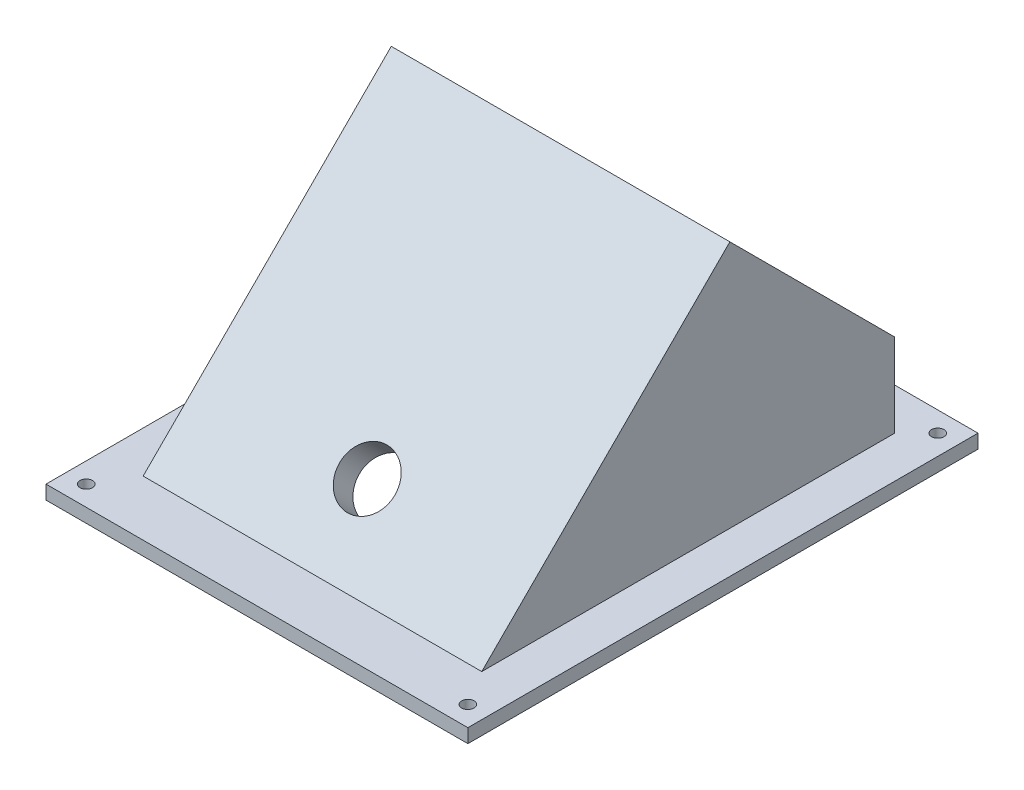
ISO-10303-21;
HEADER;
FILE_DESCRIPTION(('STEP AP214'),'2;1');
FILE_NAME('part.step','',(''),(''),'','','');
FILE_SCHEMA(('AUTOMOTIVE_DESIGN { 1 0 10303 214 1 1 1 1 }'));
ENDSEC;
DATA;
#1=APPLICATION_CONTEXT('core data for automotive mechanical design processes');
#2=APPLICATION_PROTOCOL_DEFINITION('international standard','automotive_design',2000,#1);
#3=PRODUCT_CONTEXT('',#1,'mechanical');
#4=PRODUCT('Part','Part','',(#3));
#5=PRODUCT_RELATED_PRODUCT_CATEGORY('part','',(#4));
#6=PRODUCT_DEFINITION_FORMATION('','',#4);
#7=PRODUCT_DEFINITION_CONTEXT('part definition',#1,'design');
#8=PRODUCT_DEFINITION('design','',#6,#7);
#9=PRODUCT_DEFINITION_SHAPE('','',#8);
#10=(LENGTH_UNIT() NAMED_UNIT(*) SI_UNIT(.MILLI.,.METRE.));
#11=(NAMED_UNIT(*) PLANE_ANGLE_UNIT() SI_UNIT($,.RADIAN.));
#12=(NAMED_UNIT(*) SI_UNIT($,.STERADIAN.) SOLID_ANGLE_UNIT());
#13=UNCERTAINTY_MEASURE_WITH_UNIT(LENGTH_MEASURE(1.E-05),#10,'distance_accuracy_value','');
#14=(GEOMETRIC_REPRESENTATION_CONTEXT(3) GLOBAL_UNCERTAINTY_ASSIGNED_CONTEXT((#13)) GLOBAL_UNIT_ASSIGNED_CONTEXT((#10,
#11,#12)) REPRESENTATION_CONTEXT('',''));
#15=CARTESIAN_POINT('',(0.,0.,0.));
#16=DIRECTION('',(0.,0.,1.));
#17=DIRECTION('',(1.,0.,0.));
#18=AXIS2_PLACEMENT_3D('',#15,#16,#17);
#19=CARTESIAN_POINT('',(0.,5.,0.));
#20=DIRECTION('',(0.,-1.,0.));
#21=DIRECTION('',(0.,0.,-1.));
#22=AXIS2_PLACEMENT_3D('',#19,#20,#21);
#23=PLANE('',#22);
#24=CARTESIAN_POINT('',(-7.75000000000004,5.,161.54393923934));
#25=DIRECTION('',(0.,1.,0.));
#26=DIRECTION('',(0.,0.,1.));
#27=AXIS2_PLACEMENT_3D('',#24,#25,#26);
#28=CIRCLE('',#27,2.25);
#29=CARTESIAN_POINT('',(-7.75000000000004,5.,163.79393923934));
#30=VERTEX_POINT('',#29);
#31=EDGE_CURVE('E799',#30,#30,#28,.T.);
#32=ORIENTED_EDGE('',*,*,#31,.F.);
#33=EDGE_LOOP('',(#32));
#34=FACE_BOUND('',#33,.T.);
#35=CARTESIAN_POINT('',(129.75,5.,161.54393923934));
#36=DIRECTION('',(0.,1.,0.));
#37=DIRECTION('',(0.,0.,1.));
#38=AXIS2_PLACEMENT_3D('',#35,#36,#37);
#39=CIRCLE('',#38,2.25);
#40=CARTESIAN_POINT('',(129.75,5.,163.79393923934));
#41=VERTEX_POINT('',#40);
#42=EDGE_CURVE('E803',#41,#41,#39,.T.);
#43=ORIENTED_EDGE('',*,*,#42,.F.);
#44=EDGE_LOOP('',(#43));
#45=FACE_BOUND('',#44,.T.);
#46=CARTESIAN_POINT('',(129.75,5.,-7.75000000000003));
#47=DIRECTION('',(0.,1.,0.));
#48=DIRECTION('',(0.,0.,1.));
#49=AXIS2_PLACEMENT_3D('',#46,#47,#48);
#50=CIRCLE('',#49,2.25);
#51=CARTESIAN_POINT('',(129.75,5.,-5.50000000000003));
#52=VERTEX_POINT('',#51);
#53=EDGE_CURVE('E813',#52,#52,#50,.T.);
#54=ORIENTED_EDGE('',*,*,#53,.F.);
#55=EDGE_LOOP('',(#54));
#56=FACE_BOUND('',#55,.T.);
#57=DIRECTION('',(0.,0.,-1.));
#58=VECTOR('',#57,1.);
#59=CARTESIAN_POINT('',(122.,5.,0.));
#60=LINE('',#59,#58);
#61=CARTESIAN_POINT('',(122.,5.,148.79393923934));
#62=VERTEX_POINT('',#61);
#63=CARTESIAN_POINT('',(122.,5.,0.));
#64=VERTEX_POINT('',#63);
#65=EDGE_CURVE('E250',#62,#64,#60,.T.);
#66=ORIENTED_EDGE('',*,*,#65,.F.);
#67=DIRECTION('',(-1.,0.,0.));
#68=VECTOR('',#67,1.);
#69=CARTESIAN_POINT('',(122.,5.,148.79393923934));
#70=LINE('',#69,#68);
#71=CARTESIAN_POINT('',(0.,5.,148.79393923934));
#72=VERTEX_POINT('',#71);
#73=EDGE_CURVE('E60',#62,#72,#70,.T.);
#74=ORIENTED_EDGE('',*,*,#73,.T.);
#75=DIRECTION('',(0.,0.,-1.));
#76=VECTOR('',#75,1.);
#77=CARTESIAN_POINT('',(0.,5.,0.));
#78=LINE('',#77,#76);
#79=CARTESIAN_POINT('',(0.,5.,0.));
#80=VERTEX_POINT('',#79);
#81=EDGE_CURVE('E238',#72,#80,#78,.T.);
#82=ORIENTED_EDGE('',*,*,#81,.T.);
#83=DIRECTION('',(1.,0.,0.));
#84=VECTOR('',#83,1.);
#85=CARTESIAN_POINT('',(122.,5.,0.));
#86=LINE('',#85,#84);
#87=EDGE_CURVE('E68',#80,#64,#86,.T.);
#88=ORIENTED_EDGE('',*,*,#87,.T.);
#89=EDGE_LOOP('',(#66,#74,#82,#88));
#90=FACE_BOUND('',#89,.T.);
#91=DIRECTION('',(0.,0.,1.));
#92=VECTOR('',#91,1.);
#93=CARTESIAN_POINT('',(137.,5.,-15.));
#94=LINE('',#93,#92);
#95=CARTESIAN_POINT('',(137.,5.,-15.));
#96=VERTEX_POINT('',#95);
#97=CARTESIAN_POINT('',(137.,5.,168.79393923934));
#98=VERTEX_POINT('',#97);
#99=EDGE_CURVE('E205',#96,#98,#94,.T.);
#100=ORIENTED_EDGE('',*,*,#99,.F.);
#101=DIRECTION('',(1.,0.,0.));
#102=VECTOR('',#101,1.);
#103=CARTESIAN_POINT('',(137.,5.,-15.));
#104=LINE('',#103,#102);
#105=CARTESIAN_POINT('',(-15.,5.,-15.));
#106=VERTEX_POINT('',#105);
#107=EDGE_CURVE('E198',#106,#96,#104,.T.);
#108=ORIENTED_EDGE('',*,*,#107,.F.);
#109=DIRECTION('',(0.,0.,-1.));
#110=VECTOR('',#109,1.);
#111=CARTESIAN_POINT('',(-15.,5.,-15.));
#112=LINE('',#111,#110);
#113=CARTESIAN_POINT('',(-15.,5.,168.79393923934));
#114=VERTEX_POINT('',#113);
#115=EDGE_CURVE('E208',#114,#106,#112,.T.);
#116=ORIENTED_EDGE('',*,*,#115,.F.);
#117=DIRECTION('',(-1.,0.,0.));
#118=VECTOR('',#117,1.);
#119=CARTESIAN_POINT('',(137.,5.,168.79393923934));
#120=LINE('',#119,#118);
#121=EDGE_CURVE('E189',#98,#114,#120,.T.);
#122=ORIENTED_EDGE('',*,*,#121,.F.);
#123=EDGE_LOOP('',(#100,#108,#116,#122));
#124=FACE_BOUND('',#123,.T.);
#125=CARTESIAN_POINT('',(-7.75000000000004,5.,-7.75000000000002));
#126=DIRECTION('',(0.,1.,0.));
#127=DIRECTION('',(0.,0.,1.));
#128=AXIS2_PLACEMENT_3D('',#125,#126,#127);
#129=CIRCLE('',#128,2.25);
#130=CARTESIAN_POINT('',(-7.75000000000004,5.,-5.50000000000002));
#131=VERTEX_POINT('',#130);
#132=EDGE_CURVE('E820',#131,#131,#129,.T.);
#133=ORIENTED_EDGE('',*,*,#132,.F.);
#134=EDGE_LOOP('',(#133));
#135=FACE_BOUND('',#134,.T.);
#136=ADVANCED_FACE('F43',(#34,#45,#56,#90,#124,#135),#23,.F.);
#137=CARTESIAN_POINT('',(122.,0.,0.));
#138=DIRECTION('',(0.,0.,1.));
#139=DIRECTION('',(1.,0.,0.));
#140=AXIS2_PLACEMENT_3D('',#137,#138,#139);
#141=PLANE('',#140);
#142=ORIENTED_EDGE('',*,*,#87,.F.);
#143=DIRECTION('',(0.,1.,0.));
#144=VECTOR('',#143,1.);
#145=CARTESIAN_POINT('',(0.,0.,0.));
#146=LINE('',#145,#144);
#147=CARTESIAN_POINT('',(0.,35.,0.));
#148=VERTEX_POINT('',#147);
#149=EDGE_CURVE('E386',#80,#148,#146,.T.);
#150=ORIENTED_EDGE('',*,*,#149,.T.);
#151=DIRECTION('',(-1.,0.,0.));
#152=VECTOR('',#151,1.);
#153=CARTESIAN_POINT('',(122.,35.,0.));
#154=LINE('',#153,#152);
#155=CARTESIAN_POINT('',(122.,35.,0.));
#156=VERTEX_POINT('',#155);
#157=EDGE_CURVE('E11',#156,#148,#154,.T.);
#158=ORIENTED_EDGE('',*,*,#157,.F.);
#159=DIRECTION('',(0.,1.,0.));
#160=VECTOR('',#159,1.);
#161=CARTESIAN_POINT('',(122.,0.,0.));
#162=LINE('',#161,#160);
#163=EDGE_CURVE('E396',#64,#156,#162,.T.);
#164=ORIENTED_EDGE('',*,*,#163,.F.);
#165=EDGE_LOOP('',(#142,#150,#158,#164));
#166=FACE_BOUND('',#165,.T.);
#167=ADVANCED_FACE('F428',(#166),#141,.F.);
#168=CARTESIAN_POINT('',(122.,94.3969696196699,59.3969696196701));
#169=DIRECTION('',(0.,-0.707106781186546,-0.707106781186549));
#170=DIRECTION('',(0.,0.707106781186549,-0.707106781186546));
#171=AXIS2_PLACEMENT_3D('',#168,#169,#170);
#172=PLANE('',#171);
#173=CARTESIAN_POINT('',(61.,24.7487373415292,129.045201897811));
#174=DIRECTION('',(0.,-0.707106781186546,-0.707106781186549));
#175=DIRECTION('',(0.,0.707106781186549,-0.707106781186546));
#176=AXIS2_PLACEMENT_3D('',#173,#174,#175);
#177=CIRCLE('',#176,9.99999999999998);
#178=CARTESIAN_POINT('',(61.,31.8198051533947,121.974134085945));
#179=VERTEX_POINT('',#178);
#180=EDGE_CURVE('E257',#179,#179,#177,.T.);
#181=ORIENTED_EDGE('',*,*,#180,.T.);
#182=EDGE_LOOP('',(#181));
#183=FACE_BOUND('',#182,.T.);
#184=ORIENTED_EDGE('',*,*,#73,.F.);
#185=DIRECTION('',(0.,-0.707106781186549,0.707106781186546));
#186=VECTOR('',#185,1.);
#187=CARTESIAN_POINT('',(122.,94.3969696196699,59.3969696196701));
#188=LINE('',#187,#186);
#189=CARTESIAN_POINT('',(122.,94.3969696196699,59.3969696196701));
#190=VERTEX_POINT('',#189);
#191=EDGE_CURVE('E403',#190,#62,#188,.T.);
#192=ORIENTED_EDGE('',*,*,#191,.F.);
#193=DIRECTION('',(-1.,0.,0.));
#194=VECTOR('',#193,1.);
#195=CARTESIAN_POINT('',(122.,94.3969696196699,59.3969696196701));
#196=LINE('',#195,#194);
#197=CARTESIAN_POINT('',(0.,94.3969696196699,59.3969696196701));
#198=VERTEX_POINT('',#197);
#199=EDGE_CURVE('E53',#190,#198,#196,.T.);
#200=ORIENTED_EDGE('',*,*,#199,.T.);
#201=DIRECTION('',(0.,-0.707106781186549,0.707106781186546));
#202=VECTOR('',#201,1.);
#203=CARTESIAN_POINT('',(0.,94.3969696196699,59.3969696196701));
#204=LINE('',#203,#202);
#205=EDGE_CURVE('E400',#198,#72,#204,.T.);
#206=ORIENTED_EDGE('',*,*,#205,.T.);
#207=EDGE_LOOP('',(#184,#192,#200,#206));
#208=FACE_BOUND('',#207,.T.);
#209=ADVANCED_FACE('F417',(#183,#208),#172,.F.);
#210=CARTESIAN_POINT('',(122.,0.,0.));
#211=DIRECTION('',(1.,0.,0.));
#212=DIRECTION('',(0.,0.,-1.));
#213=AXIS2_PLACEMENT_3D('',#210,#211,#212);
#214=PLANE('',#213);
#215=ORIENTED_EDGE('',*,*,#191,.T.);
#216=ORIENTED_EDGE('',*,*,#65,.T.);
#217=ORIENTED_EDGE('',*,*,#163,.T.);
#218=DIRECTION('',(0.,0.707106781186546,0.707106781186549));
#219=VECTOR('',#218,1.);
#220=CARTESIAN_POINT('',(122.,35.,0.));
#221=LINE('',#220,#219);
#222=EDGE_CURVE('E399',#156,#190,#221,.T.);
#223=ORIENTED_EDGE('',*,*,#222,.T.);
#224=EDGE_LOOP('',(#215,#216,#217,#223));
#225=FACE_BOUND('',#224,.T.);
#226=ADVANCED_FACE('F425',(#225),#214,.T.);
#227=CARTESIAN_POINT('',(0.,0.,0.));
#228=DIRECTION('',(1.,0.,0.));
#229=DIRECTION('',(0.,0.,-1.));
#230=AXIS2_PLACEMENT_3D('',#227,#228,#229);
#231=PLANE('',#230);
#232=ORIENTED_EDGE('',*,*,#81,.F.);
#233=ORIENTED_EDGE('',*,*,#205,.F.);
#234=DIRECTION('',(0.,0.707106781186546,0.707106781186549));
#235=VECTOR('',#234,1.);
#236=CARTESIAN_POINT('',(0.,35.,0.));
#237=LINE('',#236,#235);
#238=EDGE_CURVE('E408',#148,#198,#237,.T.);
#239=ORIENTED_EDGE('',*,*,#238,.F.);
#240=ORIENTED_EDGE('',*,*,#149,.F.);
#241=EDGE_LOOP('',(#232,#233,#239,#240));
#242=FACE_BOUND('',#241,.T.);
#243=ADVANCED_FACE('F422',(#242),#231,.F.);
#244=CARTESIAN_POINT('',(122.,0.,153.79393923934));
#245=DIRECTION('',(0.,1.,0.));
#246=DIRECTION('',(0.,0.,1.));
#247=AXIS2_PLACEMENT_3D('',#244,#245,#246);
#248=PLANE('',#247);
#249=CARTESIAN_POINT('',(-7.75000000000004,0.,161.54393923934));
#250=DIRECTION('',(0.,1.,0.));
#251=DIRECTION('',(0.,0.,1.));
#252=AXIS2_PLACEMENT_3D('',#249,#250,#251);
#253=CIRCLE('',#252,2.25);
#254=CARTESIAN_POINT('',(-7.75000000000004,0.,163.79393923934));
#255=VERTEX_POINT('',#254);
#256=EDGE_CURVE('E797',#255,#255,#253,.T.);
#257=ORIENTED_EDGE('',*,*,#256,.T.);
#258=EDGE_LOOP('',(#257));
#259=FACE_BOUND('',#258,.T.);
#260=CARTESIAN_POINT('',(129.75,0.,161.54393923934));
#261=DIRECTION('',(0.,1.,0.));
#262=DIRECTION('',(0.,0.,1.));
#263=AXIS2_PLACEMENT_3D('',#260,#261,#262);
#264=CIRCLE('',#263,2.25);
#265=CARTESIAN_POINT('',(129.75,0.,163.79393923934));
#266=VERTEX_POINT('',#265);
#267=EDGE_CURVE('E809',#266,#266,#264,.T.);
#268=ORIENTED_EDGE('',*,*,#267,.T.);
#269=EDGE_LOOP('',(#268));
#270=FACE_BOUND('',#269,.T.);
#271=CARTESIAN_POINT('',(129.75,0.,-7.75000000000003));
#272=DIRECTION('',(0.,1.,0.));
#273=DIRECTION('',(0.,0.,1.));
#274=AXIS2_PLACEMENT_3D('',#271,#272,#273);
#275=CIRCLE('',#274,2.25);
#276=CARTESIAN_POINT('',(129.75,0.,-5.50000000000003));
#277=VERTEX_POINT('',#276);
#278=EDGE_CURVE('E817',#277,#277,#275,.T.);
#279=ORIENTED_EDGE('',*,*,#278,.T.);
#280=EDGE_LOOP('',(#279));
#281=FACE_BOUND('',#280,.T.);
#282=CARTESIAN_POINT('',(-7.75000000000004,0.,-7.75000000000002));
#283=DIRECTION('',(0.,1.,0.));
#284=DIRECTION('',(0.,0.,1.));
#285=AXIS2_PLACEMENT_3D('',#282,#283,#284);
#286=CIRCLE('',#285,2.25);
#287=CARTESIAN_POINT('',(-7.75000000000004,0.,-5.50000000000002));
#288=VERTEX_POINT('',#287);
#289=EDGE_CURVE('E221',#288,#288,#286,.T.);
#290=ORIENTED_EDGE('',*,*,#289,.T.);
#291=EDGE_LOOP('',(#290));
#292=FACE_BOUND('',#291,.T.);
#293=DIRECTION('',(-1.,0.,0.));
#294=VECTOR('',#293,1.);
#295=CARTESIAN_POINT('',(122.,0.,10.));
#296=LINE('',#295,#294);
#297=CARTESIAN_POINT('',(112.,0.,10.));
#298=VERTEX_POINT('',#297);
#299=CARTESIAN_POINT('',(10.,0.,10.));
#300=VERTEX_POINT('',#299);
#301=EDGE_CURVE('E274',#298,#300,#296,.T.);
#302=ORIENTED_EDGE('',*,*,#301,.T.);
#303=DIRECTION('',(0.,0.,-1.));
#304=VECTOR('',#303,1.);
#305=CARTESIAN_POINT('',(9.99999999999999,0.,153.79393923934));
#306=LINE('',#305,#304);
#307=CARTESIAN_POINT('',(10.,0.,139.651803615609));
#308=VERTEX_POINT('',#307);
#309=EDGE_CURVE('E269',#308,#300,#306,.T.);
#310=ORIENTED_EDGE('',*,*,#309,.F.);
#311=DIRECTION('',(-1.,0.,0.));
#312=VECTOR('',#311,1.);
#313=CARTESIAN_POINT('',(122.,0.,139.651803615609));
#314=LINE('',#313,#312);
#315=CARTESIAN_POINT('',(112.,0.,139.651803615609));
#316=VERTEX_POINT('',#315);
#317=EDGE_CURVE('E310',#316,#308,#314,.T.);
#318=ORIENTED_EDGE('',*,*,#317,.F.);
#319=DIRECTION('',(0.,0.,-1.));
#320=VECTOR('',#319,1.);
#321=CARTESIAN_POINT('',(112.,0.,153.79393923934));
#322=LINE('',#321,#320);
#323=EDGE_CURVE('E280',#316,#298,#322,.T.);
#324=ORIENTED_EDGE('',*,*,#323,.T.);
#325=EDGE_LOOP('',(#302,#310,#318,#324));
#326=FACE_BOUND('',#325,.T.);
#327=DIRECTION('',(0.,0.,1.));
#328=VECTOR('',#327,1.);
#329=CARTESIAN_POINT('',(137.,0.,-15.));
#330=LINE('',#329,#328);
#331=CARTESIAN_POINT('',(137.,0.,-15.));
#332=VERTEX_POINT('',#331);
#333=CARTESIAN_POINT('',(137.,0.,168.79393923934));
#334=VERTEX_POINT('',#333);
#335=EDGE_CURVE('E228',#332,#334,#330,.T.);
#336=ORIENTED_EDGE('',*,*,#335,.T.);
#337=DIRECTION('',(-1.,0.,0.));
#338=VECTOR('',#337,1.);
#339=CARTESIAN_POINT('',(137.,0.,168.79393923934));
#340=LINE('',#339,#338);
#341=CARTESIAN_POINT('',(-15.,0.,168.79393923934));
#342=VERTEX_POINT('',#341);
#343=EDGE_CURVE('E191',#334,#342,#340,.T.);
#344=ORIENTED_EDGE('',*,*,#343,.T.);
#345=DIRECTION('',(0.,0.,-1.));
#346=VECTOR('',#345,1.);
#347=CARTESIAN_POINT('',(-15.,0.,-15.));
#348=LINE('',#347,#346);
#349=CARTESIAN_POINT('',(-15.,0.,-15.));
#350=VERTEX_POINT('',#349);
#351=EDGE_CURVE('E218',#342,#350,#348,.T.);
#352=ORIENTED_EDGE('',*,*,#351,.T.);
#353=DIRECTION('',(1.,0.,0.));
#354=VECTOR('',#353,1.);
#355=CARTESIAN_POINT('',(137.,0.,-15.));
#356=LINE('',#355,#354);
#357=EDGE_CURVE('E214',#350,#332,#356,.T.);
#358=ORIENTED_EDGE('',*,*,#357,.T.);
#359=EDGE_LOOP('',(#336,#344,#352,#358));
#360=FACE_BOUND('',#359,.T.);
#361=ADVANCED_FACE('F45',(#259,#270,#281,#292,#326,#360),#248,.F.);
#362=CARTESIAN_POINT('',(122.,35.,0.));
#363=DIRECTION('',(0.,-0.707106781186549,0.707106781186546));
#364=DIRECTION('',(0.,-0.707106781186546,-0.707106781186549));
#365=AXIS2_PLACEMENT_3D('',#362,#363,#364);
#366=PLANE('',#365);
#367=DIRECTION('',(1.,0.,0.));
#368=VECTOR('',#367,1.);
#369=CARTESIAN_POINT('',(25.,84.143921292465,49.1439212924652));
#370=LINE('',#369,#368);
#371=CARTESIAN_POINT('',(25.,84.143921292465,49.1439212924652));
#372=VERTEX_POINT('',#371);
#373=CARTESIAN_POINT('',(97.,84.143921292465,49.1439212924652));
#374=VERTEX_POINT('',#373);
#375=EDGE_CURVE('E372',#372,#374,#370,.T.);
#376=ORIENTED_EDGE('',*,*,#375,.F.);
#377=DIRECTION('',(0.,0.707106781186546,0.707106781186549));
#378=VECTOR('',#377,1.);
#379=CARTESIAN_POINT('',(25.,45.2530483272049,10.253048327205));
#380=LINE('',#379,#378);
#381=CARTESIAN_POINT('',(25.,45.2530483272049,10.253048327205));
#382=VERTEX_POINT('',#381);
#383=EDGE_CURVE('E351',#382,#372,#380,.T.);
#384=ORIENTED_EDGE('',*,*,#383,.F.);
#385=DIRECTION('',(-1.,0.,0.));
#386=VECTOR('',#385,1.);
#387=CARTESIAN_POINT('',(25.,45.2530483272049,10.253048327205));
#388=LINE('',#387,#386);
#389=CARTESIAN_POINT('',(97.,45.2530483272049,10.253048327205));
#390=VERTEX_POINT('',#389);
#391=EDGE_CURVE('E357',#390,#382,#388,.T.);
#392=ORIENTED_EDGE('',*,*,#391,.F.);
#393=DIRECTION('',(0.,-0.707106781186546,-0.707106781186549));
#394=VECTOR('',#393,1.);
#395=CARTESIAN_POINT('',(97.,45.2530483272049,10.253048327205));
#396=LINE('',#395,#394);
#397=EDGE_CURVE('E376',#374,#390,#396,.T.);
#398=ORIENTED_EDGE('',*,*,#397,.F.);
#399=EDGE_LOOP('',(#376,#384,#392,#398));
#400=FACE_BOUND('',#399,.T.);
#401=ORIENTED_EDGE('',*,*,#238,.T.);
#402=ORIENTED_EDGE('',*,*,#199,.F.);
#403=ORIENTED_EDGE('',*,*,#222,.F.);
#404=ORIENTED_EDGE('',*,*,#157,.T.);
#405=EDGE_LOOP('',(#401,#402,#403,#404));
#406=FACE_BOUND('',#405,.T.);
#407=ADVANCED_FACE('F429',(#400,#406),#366,.F.);
#408=CARTESIAN_POINT('',(25.,16.968777079743,38.5373195746668));
#409=DIRECTION('',(-1.,0.,0.));
#410=DIRECTION('',(0.,0.,1.));
#411=AXIS2_PLACEMENT_3D('',#408,#409,#410);
#412=PLANE('',#411);
#413=ORIENTED_EDGE('',*,*,#383,.T.);
#414=DIRECTION('',(0.,0.707106781186549,-0.707106781186546));
#415=VECTOR('',#414,1.);
#416=CARTESIAN_POINT('',(25.,55.859650045003,77.428192539927));
#417=LINE('',#416,#415);
#418=CARTESIAN_POINT('',(25.,55.859650045003,77.428192539927));
#419=VERTEX_POINT('',#418);
#420=EDGE_CURVE('E369',#419,#372,#417,.T.);
#421=ORIENTED_EDGE('',*,*,#420,.F.);
#422=DIRECTION('',(0.,0.707106781186546,0.707106781186549));
#423=VECTOR('',#422,1.);
#424=CARTESIAN_POINT('',(25.,16.968777079743,38.5373195746668));
#425=LINE('',#424,#423);
#426=CARTESIAN_POINT('',(25.,16.968777079743,38.5373195746668));
#427=VERTEX_POINT('',#426);
#428=EDGE_CURVE('E352',#427,#419,#425,.T.);
#429=ORIENTED_EDGE('',*,*,#428,.F.);
#430=DIRECTION('',(0.,0.707106781186549,-0.707106781186546));
#431=VECTOR('',#430,1.);
#432=CARTESIAN_POINT('',(25.,16.968777079743,38.5373195746668));
#433=LINE('',#432,#431);
#434=EDGE_CURVE('E383',#427,#382,#433,.T.);
#435=ORIENTED_EDGE('',*,*,#434,.T.);
#436=EDGE_LOOP('',(#413,#421,#429,#435));
#437=FACE_BOUND('',#436,.T.);
#438=ADVANCED_FACE('F431',(#437),#412,.F.);
#439=CARTESIAN_POINT('',(25.,16.968777079743,38.5373195746668));
#440=DIRECTION('',(0.,-0.707106781186546,-0.707106781186549));
#441=DIRECTION('',(0.,0.707106781186549,-0.707106781186546));
#442=AXIS2_PLACEMENT_3D('',#439,#440,#441);
#443=PLANE('',#442);
#444=ORIENTED_EDGE('',*,*,#391,.T.);
#445=ORIENTED_EDGE('',*,*,#434,.F.);
#446=DIRECTION('',(-1.,0.,0.));
#447=VECTOR('',#446,1.);
#448=CARTESIAN_POINT('',(25.,16.968777079743,38.5373195746668));
#449=LINE('',#448,#447);
#450=CARTESIAN_POINT('',(97.,16.968777079743,38.5373195746668));
#451=VERTEX_POINT('',#450);
#452=EDGE_CURVE('E365',#451,#427,#449,.T.);
#453=ORIENTED_EDGE('',*,*,#452,.F.);
#454=DIRECTION('',(0.,0.707106781186549,-0.707106781186546));
#455=VECTOR('',#454,1.);
#456=CARTESIAN_POINT('',(97.,16.968777079743,38.5373195746668));
#457=LINE('',#456,#455);
#458=EDGE_CURVE('E387',#451,#390,#457,.T.);
#459=ORIENTED_EDGE('',*,*,#458,.T.);
#460=EDGE_LOOP('',(#444,#445,#453,#459));
#461=FACE_BOUND('',#460,.T.);
#462=ADVANCED_FACE('F438',(#461),#443,.F.);
#463=CARTESIAN_POINT('',(97.,16.968777079743,38.5373195746668));
#464=DIRECTION('',(1.,0.,0.));
#465=DIRECTION('',(0.,0.,-1.));
#466=AXIS2_PLACEMENT_3D('',#463,#464,#465);
#467=PLANE('',#466);
#468=ORIENTED_EDGE('',*,*,#397,.T.);
#469=ORIENTED_EDGE('',*,*,#458,.F.);
#470=DIRECTION('',(0.,-0.707106781186546,-0.707106781186549));
#471=VECTOR('',#470,1.);
#472=CARTESIAN_POINT('',(97.,16.968777079743,38.5373195746668));
#473=LINE('',#472,#471);
#474=CARTESIAN_POINT('',(97.,55.859650045003,77.428192539927));
#475=VERTEX_POINT('',#474);
#476=EDGE_CURVE('E361',#475,#451,#473,.T.);
#477=ORIENTED_EDGE('',*,*,#476,.F.);
#478=DIRECTION('',(0.,0.707106781186549,-0.707106781186546));
#479=VECTOR('',#478,1.);
#480=CARTESIAN_POINT('',(97.,55.859650045003,77.428192539927));
#481=LINE('',#480,#479);
#482=EDGE_CURVE('E390',#475,#374,#481,.T.);
#483=ORIENTED_EDGE('',*,*,#482,.T.);
#484=EDGE_LOOP('',(#468,#469,#477,#483));
#485=FACE_BOUND('',#484,.T.);
#486=ADVANCED_FACE('F519',(#485),#467,.F.);
#487=CARTESIAN_POINT('',(25.,55.859650045003,77.428192539927));
#488=DIRECTION('',(0.,0.707106781186546,0.707106781186549));
#489=DIRECTION('',(0.,-0.707106781186549,0.707106781186546));
#490=AXIS2_PLACEMENT_3D('',#487,#488,#489);
#491=PLANE('',#490);
#492=ORIENTED_EDGE('',*,*,#375,.T.);
#493=ORIENTED_EDGE('',*,*,#482,.F.);
#494=DIRECTION('',(1.,0.,0.));
#495=VECTOR('',#494,1.);
#496=CARTESIAN_POINT('',(25.,55.859650045003,77.428192539927));
#497=LINE('',#496,#495);
#498=EDGE_CURVE('E356',#419,#475,#497,.T.);
#499=ORIENTED_EDGE('',*,*,#498,.F.);
#500=ORIENTED_EDGE('',*,*,#420,.T.);
#501=EDGE_LOOP('',(#492,#493,#499,#500));
#502=FACE_BOUND('',#501,.T.);
#503=ADVANCED_FACE('F515',(#502),#491,.F.);
#504=CARTESIAN_POINT('',(0.,-10.7842712474619,10.7842712474618));
#505=DIRECTION('',(0.,0.707106781186549,-0.707106781186546));
#506=DIRECTION('',(0.,0.707106781186546,0.707106781186549));
#507=AXIS2_PLACEMENT_3D('',#504,#505,#506);
#508=PLANE('',#507);
#509=CARTESIAN_POINT('',(61.,36.414213562373,57.9827560572969));
#510=DIRECTION('',(0.,0.707106781186549,-0.707106781186546));
#511=DIRECTION('',(0.,0.707106781186546,0.707106781186549));
#512=AXIS2_PLACEMENT_3D('',#509,#510,#511);
#513=CIRCLE('',#512,9.99999999999999);
#514=CARTESIAN_POINT('',(61.,43.4852813742385,65.0538238691624));
#515=VERTEX_POINT('',#514);
#516=EDGE_CURVE('E261',#515,#515,#513,.T.);
#517=ORIENTED_EDGE('',*,*,#516,.F.);
#518=EDGE_LOOP('',(#517));
#519=FACE_BOUND('',#518,.T.);
#520=ORIENTED_EDGE('',*,*,#428,.T.);
#521=ORIENTED_EDGE('',*,*,#498,.T.);
#522=ORIENTED_EDGE('',*,*,#476,.T.);
#523=ORIENTED_EDGE('',*,*,#452,.T.);
#524=EDGE_LOOP('',(#520,#521,#522,#523));
#525=FACE_BOUND('',#524,.T.);
#526=ADVANCED_FACE('F489',(#519,#525),#508,.T.);
#527=CARTESIAN_POINT('',(122.,87.3259018078044,52.3259018078046));
#528=DIRECTION('',(0.,-0.707106781186546,-0.707106781186549));
#529=DIRECTION('',(0.,0.707106781186549,-0.707106781186546));
#530=AXIS2_PLACEMENT_3D('',#527,#528,#529);
#531=PLANE('',#530);
#532=CARTESIAN_POINT('',(61.,17.6776695296637,121.974134085945));
#533=DIRECTION('',(0.,-0.707106781186546,-0.707106781186549));
#534=DIRECTION('',(0.,0.707106781186549,-0.707106781186546));
#535=AXIS2_PLACEMENT_3D('',#532,#533,#534);
#536=CIRCLE('',#535,9.99999999999998);
#537=CARTESIAN_POINT('',(61.,24.7487373415292,114.90306627408));
#538=VERTEX_POINT('',#537);
#539=EDGE_CURVE('E253',#538,#538,#536,.T.);
#540=ORIENTED_EDGE('',*,*,#539,.F.);
#541=EDGE_LOOP('',(#540));
#542=FACE_BOUND('',#541,.T.);
#543=DIRECTION('',(1.,0.,0.));
#544=VECTOR('',#543,1.);
#545=CARTESIAN_POINT('',(122.,51.970562748477,87.6812408671319));
#546=LINE('',#545,#544);
#547=CARTESIAN_POINT('',(15.,51.970562748477,87.6812408671319));
#548=VERTEX_POINT('',#547);
#549=CARTESIAN_POINT('',(107.,51.970562748477,87.6812408671319));
#550=VERTEX_POINT('',#549);
#551=EDGE_CURVE('E347',#548,#550,#546,.T.);
#552=ORIENTED_EDGE('',*,*,#551,.T.);
#553=DIRECTION('',(0.,-0.707106781186549,0.707106781186546));
#554=VECTOR('',#553,1.);
#555=CARTESIAN_POINT('',(107.,87.3259018078044,52.3259018078046));
#556=LINE('',#555,#554);
#557=CARTESIAN_POINT('',(107.,80.2548339959389,59.3969696196701));
#558=VERTEX_POINT('',#557);
#559=EDGE_CURVE('E344',#558,#550,#556,.T.);
#560=ORIENTED_EDGE('',*,*,#559,.F.);
#561=DIRECTION('',(-1.,0.,0.));
#562=VECTOR('',#561,1.);
#563=CARTESIAN_POINT('',(122.,80.2548339959389,59.3969696196701));
#564=LINE('',#563,#562);
#565=CARTESIAN_POINT('',(112.,80.2548339959389,59.3969696196701));
#566=VERTEX_POINT('',#565);
#567=EDGE_CURVE('E300',#566,#558,#564,.T.);
#568=ORIENTED_EDGE('',*,*,#567,.F.);
#569=DIRECTION('',(0.,-0.707106781186549,0.707106781186546));
#570=VECTOR('',#569,1.);
#571=CARTESIAN_POINT('',(112.,87.3259018078044,52.3259018078046));
#572=LINE('',#571,#570);
#573=EDGE_CURVE('E304',#566,#316,#572,.T.);
#574=ORIENTED_EDGE('',*,*,#573,.T.);
#575=ORIENTED_EDGE('',*,*,#317,.T.);
#576=DIRECTION('',(0.,-0.707106781186549,0.707106781186546));
#577=VECTOR('',#576,1.);
#578=CARTESIAN_POINT('',(9.99999999999999,87.3259018078044,52.3259018078046));
#579=LINE('',#578,#577);
#580=CARTESIAN_POINT('',(10.,80.2548339959389,59.3969696196701));
#581=VERTEX_POINT('',#580);
#582=EDGE_CURVE('E296',#581,#308,#579,.T.);
#583=ORIENTED_EDGE('',*,*,#582,.F.);
#584=CARTESIAN_POINT('',(15.,80.2548339959389,59.3969696196701));
#585=VERTEX_POINT('',#584);
#586=EDGE_CURVE('E275',#585,#581,#564,.T.);
#587=ORIENTED_EDGE('',*,*,#586,.F.);
#588=DIRECTION('',(0.,-0.707106781186549,0.707106781186546));
#589=VECTOR('',#588,1.);
#590=CARTESIAN_POINT('',(15.,59.0416305603424,80.6101730552665));
#591=LINE('',#590,#589);
#592=EDGE_CURVE('E331',#585,#548,#591,.T.);
#593=ORIENTED_EDGE('',*,*,#592,.T.);
#594=EDGE_LOOP('',(#552,#560,#568,#574,#575,#583,#587,#593));
#595=FACE_BOUND('',#594,.T.);
#596=ADVANCED_FACE('F481',(#542,#595),#531,.T.);
#597=CARTESIAN_POINT('',(122.,0.,10.));
#598=DIRECTION('',(0.,0.,1.));
#599=DIRECTION('',(1.,0.,0.));
#600=AXIS2_PLACEMENT_3D('',#597,#598,#599);
#601=PLANE('',#600);
#602=DIRECTION('',(0.,1.,0.));
#603=VECTOR('',#602,1.);
#604=CARTESIAN_POINT('',(9.99999999999999,0.,10.));
#605=LINE('',#604,#603);
#606=CARTESIAN_POINT('',(10.,30.857864376269,10.));
#607=VERTEX_POINT('',#606);
#608=EDGE_CURVE('E265',#300,#607,#605,.T.);
#609=ORIENTED_EDGE('',*,*,#608,.F.);
#610=ORIENTED_EDGE('',*,*,#301,.F.);
#611=DIRECTION('',(0.,1.,0.));
#612=VECTOR('',#611,1.);
#613=CARTESIAN_POINT('',(112.,0.,10.));
#614=LINE('',#613,#612);
#615=CARTESIAN_POINT('',(112.,30.857864376269,10.));
#616=VERTEX_POINT('',#615);
#617=EDGE_CURVE('E276',#298,#616,#614,.T.);
#618=ORIENTED_EDGE('',*,*,#617,.T.);
#619=DIRECTION('',(-1.,0.,0.));
#620=VECTOR('',#619,1.);
#621=CARTESIAN_POINT('',(122.,30.857864376269,10.));
#622=LINE('',#621,#620);
#623=EDGE_CURVE('E270',#616,#607,#622,.T.);
#624=ORIENTED_EDGE('',*,*,#623,.T.);
#625=EDGE_LOOP('',(#609,#610,#618,#624));
#626=FACE_BOUND('',#625,.T.);
#627=ADVANCED_FACE('F477',(#626),#601,.T.);
#628=CARTESIAN_POINT('',(122.,27.9289321881345,7.07106781186546));
#629=DIRECTION('',(0.,-0.707106781186549,0.707106781186546));
#630=DIRECTION('',(0.,-0.707106781186546,-0.707106781186549));
#631=AXIS2_PLACEMENT_3D('',#628,#629,#630);
#632=PLANE('',#631);
#633=ORIENTED_EDGE('',*,*,#586,.T.);
#634=DIRECTION('',(0.,0.707106781186546,0.707106781186549));
#635=VECTOR('',#634,1.);
#636=CARTESIAN_POINT('',(9.99999999999999,27.9289321881345,7.07106781186546));
#637=LINE('',#636,#635);
#638=EDGE_CURVE('E268',#607,#581,#637,.T.);
#639=ORIENTED_EDGE('',*,*,#638,.F.);
#640=ORIENTED_EDGE('',*,*,#623,.F.);
#641=DIRECTION('',(0.,0.707106781186546,0.707106781186549));
#642=VECTOR('',#641,1.);
#643=CARTESIAN_POINT('',(112.,27.9289321881345,7.07106781186546));
#644=LINE('',#643,#642);
#645=EDGE_CURVE('E279',#616,#566,#644,.T.);
#646=ORIENTED_EDGE('',*,*,#645,.T.);
#647=ORIENTED_EDGE('',*,*,#567,.T.);
#648=DIRECTION('',(0.,-0.707106781186546,-0.707106781186549));
#649=VECTOR('',#648,1.);
#650=CARTESIAN_POINT('',(107.,38.1819805153394,17.3241161390704));
#651=LINE('',#650,#649);
#652=CARTESIAN_POINT('',(107.,31.110912703474,10.2530483272049));
#653=VERTEX_POINT('',#652);
#654=EDGE_CURVE('E285',#558,#653,#651,.T.);
#655=ORIENTED_EDGE('',*,*,#654,.T.);
#656=DIRECTION('',(-1.,0.,0.));
#657=VECTOR('',#656,1.);
#658=CARTESIAN_POINT('',(25.,31.110912703474,10.2530483272049));
#659=LINE('',#658,#657);
#660=CARTESIAN_POINT('',(15.,31.110912703474,10.2530483272049));
#661=VERTEX_POINT('',#660);
#662=EDGE_CURVE('E286',#653,#661,#659,.T.);
#663=ORIENTED_EDGE('',*,*,#662,.T.);
#664=DIRECTION('',(0.,0.707106781186546,0.707106781186549));
#665=VECTOR('',#664,1.);
#666=CARTESIAN_POINT('',(15.,38.1819805153394,17.3241161390704));
#667=LINE('',#666,#665);
#668=EDGE_CURVE('E281',#661,#585,#667,.T.);
#669=ORIENTED_EDGE('',*,*,#668,.T.);
#670=EDGE_LOOP('',(#633,#639,#640,#646,#647,#655,#663,#669));
#671=FACE_BOUND('',#670,.T.);
#672=ADVANCED_FACE('F480',(#671),#632,.T.);
#673=CARTESIAN_POINT('',(112.,0.,0.));
#674=DIRECTION('',(1.,0.,0.));
#675=DIRECTION('',(0.,0.,-1.));
#676=AXIS2_PLACEMENT_3D('',#673,#674,#675);
#677=PLANE('',#676);
#678=ORIENTED_EDGE('',*,*,#323,.F.);
#679=ORIENTED_EDGE('',*,*,#573,.F.);
#680=ORIENTED_EDGE('',*,*,#645,.F.);
#681=ORIENTED_EDGE('',*,*,#617,.F.);
#682=EDGE_LOOP('',(#678,#679,#680,#681));
#683=FACE_BOUND('',#682,.T.);
#684=ADVANCED_FACE('F485',(#683),#677,.F.);
#685=CARTESIAN_POINT('',(10.,0.,0.));
#686=DIRECTION('',(1.,0.,0.));
#687=DIRECTION('',(0.,0.,-1.));
#688=AXIS2_PLACEMENT_3D('',#685,#686,#687);
#689=PLANE('',#688);
#690=ORIENTED_EDGE('',*,*,#608,.T.);
#691=ORIENTED_EDGE('',*,*,#638,.T.);
#692=ORIENTED_EDGE('',*,*,#582,.T.);
#693=ORIENTED_EDGE('',*,*,#309,.T.);
#694=EDGE_LOOP('',(#690,#691,#692,#693));
#695=FACE_BOUND('',#694,.T.);
#696=ADVANCED_FACE('F493',(#695),#689,.T.);
#697=CARTESIAN_POINT('',(15.,16.968777079743,38.5373195746668));
#698=DIRECTION('',(-1.,0.,0.));
#699=DIRECTION('',(0.,0.,1.));
#700=AXIS2_PLACEMENT_3D('',#697,#698,#699);
#701=PLANE('',#700);
#702=ORIENTED_EDGE('',*,*,#668,.F.);
#703=DIRECTION('',(0.,0.707106781186549,-0.707106781186546));
#704=VECTOR('',#703,1.);
#705=CARTESIAN_POINT('',(15.,9.89770926787751,31.4662517628013));
#706=LINE('',#705,#704);
#707=CARTESIAN_POINT('',(15.,2.82664145601202,38.5373195746668));
#708=VERTEX_POINT('',#707);
#709=EDGE_CURVE('E315',#708,#661,#706,.T.);
#710=ORIENTED_EDGE('',*,*,#709,.F.);
#711=DIRECTION('',(0.,0.707106781186546,0.707106781186549));
#712=VECTOR('',#711,1.);
#713=CARTESIAN_POINT('',(15.,-17.8553390593274,17.8553390593273));
#714=LINE('',#713,#712);
#715=EDGE_CURVE('E290',#708,#548,#714,.T.);
#716=ORIENTED_EDGE('',*,*,#715,.T.);
#717=ORIENTED_EDGE('',*,*,#592,.F.);
#718=EDGE_LOOP('',(#702,#710,#716,#717));
#719=FACE_BOUND('',#718,.T.);
#720=ADVANCED_FACE('F497',(#719),#701,.T.);
#721=CARTESIAN_POINT('',(25.,9.89770926787751,31.4662517628013));
#722=DIRECTION('',(0.,-0.707106781186546,-0.707106781186549));
#723=DIRECTION('',(0.,0.707106781186549,-0.707106781186546));
#724=AXIS2_PLACEMENT_3D('',#721,#722,#723);
#725=PLANE('',#724);
#726=ORIENTED_EDGE('',*,*,#662,.F.);
#727=DIRECTION('',(0.,0.707106781186549,-0.707106781186546));
#728=VECTOR('',#727,1.);
#729=CARTESIAN_POINT('',(107.,9.89770926787751,31.4662517628013));
#730=LINE('',#729,#728);
#731=CARTESIAN_POINT('',(107.,2.82664145601202,38.5373195746668));
#732=VERTEX_POINT('',#731);
#733=EDGE_CURVE('E319',#732,#653,#730,.T.);
#734=ORIENTED_EDGE('',*,*,#733,.F.);
#735=DIRECTION('',(-1.,0.,0.));
#736=VECTOR('',#735,1.);
#737=CARTESIAN_POINT('',(0.,2.82664145601202,38.5373195746668));
#738=LINE('',#737,#736);
#739=EDGE_CURVE('E320',#732,#708,#738,.T.);
#740=ORIENTED_EDGE('',*,*,#739,.T.);
#741=ORIENTED_EDGE('',*,*,#709,.T.);
#742=EDGE_LOOP('',(#726,#734,#740,#741));
#743=FACE_BOUND('',#742,.T.);
#744=ADVANCED_FACE('F501',(#743),#725,.T.);
#745=CARTESIAN_POINT('',(107.,16.968777079743,38.5373195746668));
#746=DIRECTION('',(1.,0.,0.));
#747=DIRECTION('',(0.,0.,-1.));
#748=AXIS2_PLACEMENT_3D('',#745,#746,#747);
#749=PLANE('',#748);
#750=ORIENTED_EDGE('',*,*,#559,.T.);
#751=DIRECTION('',(0.,-0.707106781186546,-0.707106781186549));
#752=VECTOR('',#751,1.);
#753=CARTESIAN_POINT('',(107.,-17.8553390593274,17.8553390593273));
#754=LINE('',#753,#752);
#755=EDGE_CURVE('E314',#550,#732,#754,.T.);
#756=ORIENTED_EDGE('',*,*,#755,.T.);
#757=ORIENTED_EDGE('',*,*,#733,.T.);
#758=ORIENTED_EDGE('',*,*,#654,.F.);
#759=EDGE_LOOP('',(#750,#756,#757,#758));
#760=FACE_BOUND('',#759,.T.);
#761=ADVANCED_FACE('F505',(#760),#749,.T.);
#762=CARTESIAN_POINT('',(0.,-17.8553390593274,17.8553390593273));
#763=DIRECTION('',(0.,0.707106781186549,-0.707106781186546));
#764=DIRECTION('',(0.,0.707106781186546,0.707106781186549));
#765=AXIS2_PLACEMENT_3D('',#762,#763,#764);
#766=PLANE('',#765);
#767=CARTESIAN_POINT('',(61.,29.3431457505075,65.0538238691624));
#768=DIRECTION('',(0.,0.707106781186549,-0.707106781186546));
#769=DIRECTION('',(0.,0.707106781186546,0.707106781186549));
#770=AXIS2_PLACEMENT_3D('',#767,#768,#769);
#771=CIRCLE('',#770,9.99999999999999);
#772=CARTESIAN_POINT('',(61.,36.414213562373,72.1248916810278));
#773=VERTEX_POINT('',#772);
#774=EDGE_CURVE('E47',#773,#773,#771,.T.);
#775=ORIENTED_EDGE('',*,*,#774,.T.);
#776=EDGE_LOOP('',(#775));
#777=FACE_BOUND('',#776,.T.);
#778=ORIENTED_EDGE('',*,*,#715,.F.);
#779=ORIENTED_EDGE('',*,*,#739,.F.);
#780=ORIENTED_EDGE('',*,*,#755,.F.);
#781=ORIENTED_EDGE('',*,*,#551,.F.);
#782=EDGE_LOOP('',(#778,#779,#780,#781));
#783=FACE_BOUND('',#782,.T.);
#784=ADVANCED_FACE('F475',(#777,#783),#766,.F.);
#785=CARTESIAN_POINT('',(61.,8.12994231491105,86.2670273047587));
#786=DIRECTION('',(0.,0.707106781186549,-0.707106781186546));
#787=DIRECTION('',(0.,0.707106781186546,0.707106781186549));
#788=AXIS2_PLACEMENT_3D('',#785,#786,#787);
#789=CYLINDRICAL_SURFACE('',#788,9.99999999999999);
#790=ORIENTED_EDGE('',*,*,#516,.T.);
#791=EDGE_LOOP('',(#790));
#792=FACE_BOUND('',#791,.T.);
#793=ORIENTED_EDGE('',*,*,#774,.F.);
#794=EDGE_LOOP('',(#793));
#795=FACE_BOUND('',#794,.T.);
#796=ADVANCED_FACE('F471',(#792,#795),#789,.F.);
#797=CARTESIAN_POINT('',(61.,45.9619407771256,150.258405333407));
#798=DIRECTION('',(0.,-0.707106781186546,-0.707106781186549));
#799=DIRECTION('',(0.,0.707106781186549,-0.707106781186546));
#800=AXIS2_PLACEMENT_3D('',#797,#798,#799);
#801=CYLINDRICAL_SURFACE('',#800,9.99999999999998);
#802=ORIENTED_EDGE('',*,*,#539,.T.);
#803=EDGE_LOOP('',(#802));
#804=FACE_BOUND('',#803,.T.);
#805=ORIENTED_EDGE('',*,*,#180,.F.);
#806=EDGE_LOOP('',(#805));
#807=FACE_BOUND('',#806,.T.);
#808=ADVANCED_FACE('F468',(#804,#807),#801,.F.);
#809=CARTESIAN_POINT('',(137.,5.,-15.));
#810=DIRECTION('',(1.,0.,0.));
#811=DIRECTION('',(0.,0.,-1.));
#812=AXIS2_PLACEMENT_3D('',#809,#810,#811);
#813=PLANE('',#812);
#814=ORIENTED_EDGE('',*,*,#335,.F.);
#815=DIRECTION('',(0.,-1.,0.));
#816=VECTOR('',#815,1.);
#817=CARTESIAN_POINT('',(137.,5.,-15.));
#818=LINE('',#817,#816);
#819=EDGE_CURVE('E212',#96,#332,#818,.T.);
#820=ORIENTED_EDGE('',*,*,#819,.F.);
#821=ORIENTED_EDGE('',*,*,#99,.T.);
#822=DIRECTION('',(0.,-1.,0.));
#823=VECTOR('',#822,1.);
#824=CARTESIAN_POINT('',(137.,5.,168.79393923934));
#825=LINE('',#824,#823);
#826=EDGE_CURVE('E186',#98,#334,#825,.T.);
#827=ORIENTED_EDGE('',*,*,#826,.T.);
#828=EDGE_LOOP('',(#814,#820,#821,#827));
#829=FACE_BOUND('',#828,.T.);
#830=ADVANCED_FACE('F211',(#829),#813,.T.);
#831=CARTESIAN_POINT('',(137.,5.,-15.));
#832=DIRECTION('',(0.,0.,-1.));
#833=DIRECTION('',(-1.,0.,0.));
#834=AXIS2_PLACEMENT_3D('',#831,#832,#833);
#835=PLANE('',#834);
#836=ORIENTED_EDGE('',*,*,#357,.F.);
#837=DIRECTION('',(0.,-1.,0.));
#838=VECTOR('',#837,1.);
#839=CARTESIAN_POINT('',(-15.,5.,-15.));
#840=LINE('',#839,#838);
#841=EDGE_CURVE('E239',#106,#350,#840,.T.);
#842=ORIENTED_EDGE('',*,*,#841,.F.);
#843=ORIENTED_EDGE('',*,*,#107,.T.);
#844=ORIENTED_EDGE('',*,*,#819,.T.);
#845=EDGE_LOOP('',(#836,#842,#843,#844));
#846=FACE_BOUND('',#845,.T.);
#847=ADVANCED_FACE('F456',(#846),#835,.T.);
#848=CARTESIAN_POINT('',(-15.,5.,-15.));
#849=DIRECTION('',(-1.,0.,0.));
#850=DIRECTION('',(0.,0.,1.));
#851=AXIS2_PLACEMENT_3D('',#848,#849,#850);
#852=PLANE('',#851);
#853=ORIENTED_EDGE('',*,*,#351,.F.);
#854=DIRECTION('',(0.,-1.,0.));
#855=VECTOR('',#854,1.);
#856=CARTESIAN_POINT('',(-15.,5.,168.79393923934));
#857=LINE('',#856,#855);
#858=EDGE_CURVE('E197',#114,#342,#857,.T.);
#859=ORIENTED_EDGE('',*,*,#858,.F.);
#860=ORIENTED_EDGE('',*,*,#115,.T.);
#861=ORIENTED_EDGE('',*,*,#841,.T.);
#862=EDGE_LOOP('',(#853,#859,#860,#861));
#863=FACE_BOUND('',#862,.T.);
#864=ADVANCED_FACE('F459',(#863),#852,.T.);
#865=CARTESIAN_POINT('',(137.,5.,168.79393923934));
#866=DIRECTION('',(0.,0.,1.));
#867=DIRECTION('',(1.,0.,0.));
#868=AXIS2_PLACEMENT_3D('',#865,#866,#867);
#869=PLANE('',#868);
#870=ORIENTED_EDGE('',*,*,#343,.F.);
#871=ORIENTED_EDGE('',*,*,#826,.F.);
#872=ORIENTED_EDGE('',*,*,#121,.T.);
#873=ORIENTED_EDGE('',*,*,#858,.T.);
#874=EDGE_LOOP('',(#870,#871,#872,#873));
#875=FACE_BOUND('',#874,.T.);
#876=ADVANCED_FACE('F188',(#875),#869,.T.);
#877=CARTESIAN_POINT('',(-7.75000000000004,5.,-7.75000000000002));
#878=DIRECTION('',(0.,1.,0.));
#879=DIRECTION('',(0.,0.,1.));
#880=AXIS2_PLACEMENT_3D('',#877,#878,#879);
#881=CYLINDRICAL_SURFACE('',#880,2.25);
#882=ORIENTED_EDGE('',*,*,#289,.F.);
#883=EDGE_LOOP('',(#882));
#884=FACE_BOUND('',#883,.T.);
#885=ORIENTED_EDGE('',*,*,#132,.T.);
#886=EDGE_LOOP('',(#885));
#887=FACE_BOUND('',#886,.T.);
#888=ADVANCED_FACE('F454',(#884,#887),#881,.F.);
#889=CARTESIAN_POINT('',(129.75,5.,-7.75000000000003));
#890=DIRECTION('',(0.,1.,0.));
#891=DIRECTION('',(0.,0.,1.));
#892=AXIS2_PLACEMENT_3D('',#889,#890,#891);
#893=CYLINDRICAL_SURFACE('',#892,2.25);
#894=ORIENTED_EDGE('',*,*,#278,.F.);
#895=EDGE_LOOP('',(#894));
#896=FACE_BOUND('',#895,.T.);
#897=ORIENTED_EDGE('',*,*,#53,.T.);
#898=EDGE_LOOP('',(#897));
#899=FACE_BOUND('',#898,.T.);
#900=ADVANCED_FACE('F566',(#896,#899),#893,.F.);
#901=CARTESIAN_POINT('',(129.75,5.,161.54393923934));
#902=DIRECTION('',(0.,1.,0.));
#903=DIRECTION('',(0.,0.,1.));
#904=AXIS2_PLACEMENT_3D('',#901,#902,#903);
#905=CYLINDRICAL_SURFACE('',#904,2.25);
#906=ORIENTED_EDGE('',*,*,#267,.F.);
#907=EDGE_LOOP('',(#906));
#908=FACE_BOUND('',#907,.T.);
#909=ORIENTED_EDGE('',*,*,#42,.T.);
#910=EDGE_LOOP('',(#909));
#911=FACE_BOUND('',#910,.T.);
#912=ADVANCED_FACE('F577',(#908,#911),#905,.F.);
#913=CARTESIAN_POINT('',(-7.75000000000004,5.,161.54393923934));
#914=DIRECTION('',(0.,1.,0.));
#915=DIRECTION('',(0.,0.,1.));
#916=AXIS2_PLACEMENT_3D('',#913,#914,#915);
#917=CYLINDRICAL_SURFACE('',#916,2.25);
#918=ORIENTED_EDGE('',*,*,#256,.F.);
#919=EDGE_LOOP('',(#918));
#920=FACE_BOUND('',#919,.T.);
#921=ORIENTED_EDGE('',*,*,#31,.T.);
#922=EDGE_LOOP('',(#921));
#923=FACE_BOUND('',#922,.T.);
#924=ADVANCED_FACE('F587',(#920,#923),#917,.F.);
#925=CLOSED_SHELL('',(#136,#167,#209,#226,#243,#361,#407,#438,#462,#486,#503,#526,#596,#627,
#672,#684,#696,#720,#744,#761,#784,#796,#808,#830,#847,#864,#876,#888,#900,#912,#924));
#926=MANIFOLD_SOLID_BREP('B2',#925);
#927=ADVANCED_BREP_SHAPE_REPRESENTATION('',(#18,#926),#14);
#928=SHAPE_DEFINITION_REPRESENTATION(#9,#927);
ENDSEC;
END-ISO-10303-21;
